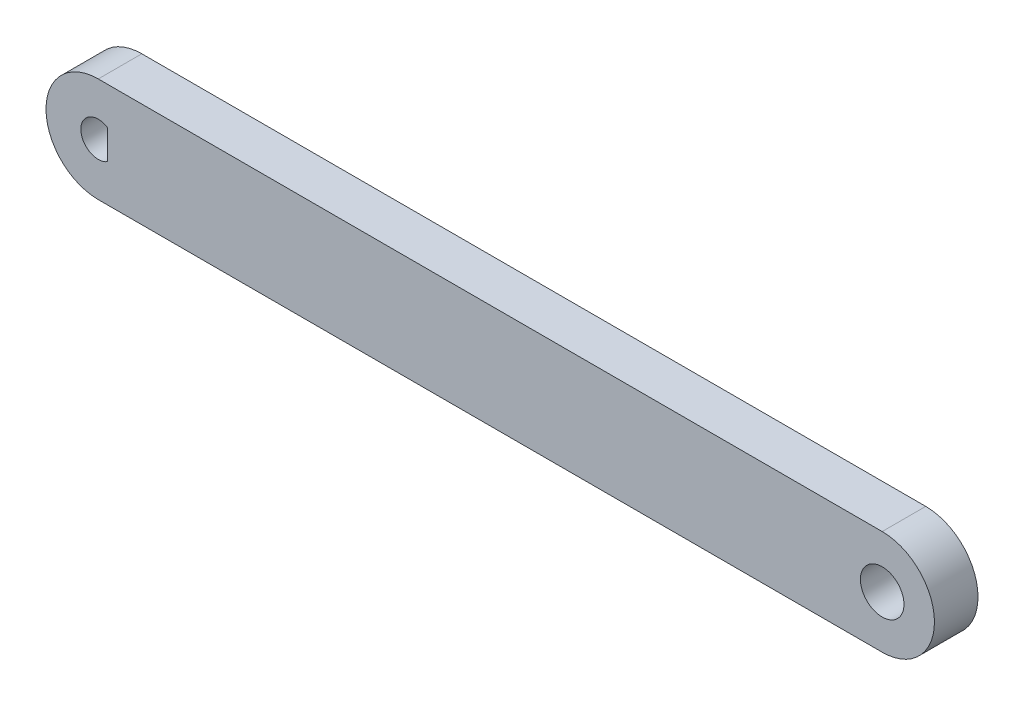
ISO-10303-21;
HEADER;
FILE_DESCRIPTION(('STEP AP214'),'2;1');
FILE_NAME('part.step','',(''),(''),'','','');
FILE_SCHEMA(('AUTOMOTIVE_DESIGN { 1 0 10303 214 1 1 1 1 }'));
ENDSEC;
DATA;
#1=APPLICATION_CONTEXT('core data for automotive mechanical design processes');
#2=APPLICATION_PROTOCOL_DEFINITION('international standard','automotive_design',2000,#1);
#3=PRODUCT_CONTEXT('',#1,'mechanical');
#4=PRODUCT('Part','Part','',(#3));
#5=PRODUCT_RELATED_PRODUCT_CATEGORY('part','',(#4));
#6=PRODUCT_DEFINITION_FORMATION('','',#4);
#7=PRODUCT_DEFINITION_CONTEXT('part definition',#1,'design');
#8=PRODUCT_DEFINITION('design','',#6,#7);
#9=PRODUCT_DEFINITION_SHAPE('','',#8);
#10=(LENGTH_UNIT() NAMED_UNIT(*) SI_UNIT(.MILLI.,.METRE.));
#11=(NAMED_UNIT(*) PLANE_ANGLE_UNIT() SI_UNIT($,.RADIAN.));
#12=(NAMED_UNIT(*) SI_UNIT($,.STERADIAN.) SOLID_ANGLE_UNIT());
#13=UNCERTAINTY_MEASURE_WITH_UNIT(LENGTH_MEASURE(1.E-05),#10,'distance_accuracy_value','');
#14=(GEOMETRIC_REPRESENTATION_CONTEXT(3) GLOBAL_UNCERTAINTY_ASSIGNED_CONTEXT((#13)) GLOBAL_UNIT_ASSIGNED_CONTEXT((#10,
#11,#12)) REPRESENTATION_CONTEXT('',''));
#15=CARTESIAN_POINT('',(0.,0.,0.));
#16=DIRECTION('',(0.,0.,1.));
#17=DIRECTION('',(1.,0.,0.));
#18=AXIS2_PLACEMENT_3D('',#15,#16,#17);
#19=CARTESIAN_POINT('',(-45.,0.,2.5));
#20=DIRECTION('',(0.,0.,1.));
#21=DIRECTION('',(1.,0.,0.));
#22=AXIS2_PLACEMENT_3D('',#19,#20,#21);
#23=PLANE('',#22);
#24=CARTESIAN_POINT('',(45.,0.,2.5));
#25=DIRECTION('',(0.,0.,1.));
#26=DIRECTION('',(1.,0.,0.));
#27=AXIS2_PLACEMENT_3D('',#24,#25,#26);
#28=CIRCLE('',#27,2.49999999999999);
#29=CARTESIAN_POINT('',(47.5,0.,2.5));
#30=VERTEX_POINT('',#29);
#31=EDGE_CURVE('E131',#30,#30,#28,.T.);
#32=ORIENTED_EDGE('',*,*,#31,.F.);
#33=EDGE_LOOP('',(#32));
#34=FACE_BOUND('',#33,.T.);
#35=CARTESIAN_POINT('',(-45.,0.,2.5));
#36=DIRECTION('',(0.,0.,1.));
#37=DIRECTION('',(1.,0.,0.));
#38=AXIS2_PLACEMENT_3D('',#35,#36,#37);
#39=CIRCLE('',#38,6.00000000000002);
#40=CARTESIAN_POINT('',(-45.,6.00000000000002,2.5));
#41=VERTEX_POINT('',#40);
#42=CARTESIAN_POINT('',(-45.,-6.00000000000002,2.5));
#43=VERTEX_POINT('',#42);
#44=EDGE_CURVE('E137',#41,#43,#39,.T.);
#45=ORIENTED_EDGE('',*,*,#44,.T.);
#46=DIRECTION('',(1.,0.,0.));
#47=VECTOR('',#46,1.);
#48=CARTESIAN_POINT('',(-45.,-6.00000000000002,2.5));
#49=LINE('',#48,#47);
#50=CARTESIAN_POINT('',(45.,-6.,2.5));
#51=VERTEX_POINT('',#50);
#52=EDGE_CURVE('E91',#43,#51,#49,.T.);
#53=ORIENTED_EDGE('',*,*,#52,.T.);
#54=CARTESIAN_POINT('',(45.,0.,2.5));
#55=DIRECTION('',(0.,0.,1.));
#56=DIRECTION('',(1.,0.,0.));
#57=AXIS2_PLACEMENT_3D('',#54,#55,#56);
#58=CIRCLE('',#57,6.00000000000002);
#59=CARTESIAN_POINT('',(45.,6.00000000000003,2.5));
#60=VERTEX_POINT('',#59);
#61=EDGE_CURVE('E140',#51,#60,#58,.T.);
#62=ORIENTED_EDGE('',*,*,#61,.T.);
#63=DIRECTION('',(-1.,0.,0.));
#64=VECTOR('',#63,1.);
#65=CARTESIAN_POINT('',(-45.,6.00000000000002,2.5));
#66=LINE('',#65,#64);
#67=EDGE_CURVE('E60',#60,#41,#66,.T.);
#68=ORIENTED_EDGE('',*,*,#67,.T.);
#69=EDGE_LOOP('',(#45,#53,#62,#68));
#70=FACE_BOUND('',#69,.T.);
#71=CARTESIAN_POINT('',(-45.,0.,2.5));
#72=DIRECTION('',(0.,0.,1.));
#73=DIRECTION('',(1.,0.,0.));
#74=AXIS2_PLACEMENT_3D('',#71,#72,#73);
#75=CIRCLE('',#74,2.);
#76=CARTESIAN_POINT('',(-43.934051012223,1.6922626142113,2.5));
#77=VERTEX_POINT('',#76);
#78=CARTESIAN_POINT('',(-43.934051012223,-1.6922626142113,2.5));
#79=VERTEX_POINT('',#78);
#80=EDGE_CURVE('E125',#77,#79,#75,.T.);
#81=ORIENTED_EDGE('',*,*,#80,.F.);
#82=DIRECTION('',(0.,1.,0.));
#83=VECTOR('',#82,1.);
#84=CARTESIAN_POINT('',(-43.934051012223,0.,2.5));
#85=LINE('',#84,#83);
#86=EDGE_CURVE('E117',#79,#77,#85,.T.);
#87=ORIENTED_EDGE('',*,*,#86,.F.);
#88=EDGE_LOOP('',(#81,#87));
#89=FACE_BOUND('',#88,.T.);
#90=ADVANCED_FACE('F43',(#34,#70,#89),#23,.T.);
#91=CARTESIAN_POINT('',(-45.,0.,-2.5));
#92=DIRECTION('',(0.,0.,1.));
#93=DIRECTION('',(1.,0.,0.));
#94=AXIS2_PLACEMENT_3D('',#91,#92,#93);
#95=PLANE('',#94);
#96=CARTESIAN_POINT('',(-45.,0.,-2.5));
#97=DIRECTION('',(0.,0.,1.));
#98=DIRECTION('',(1.,0.,0.));
#99=AXIS2_PLACEMENT_3D('',#96,#97,#98);
#100=CIRCLE('',#99,6.00000000000002);
#101=CARTESIAN_POINT('',(-45.,6.00000000000002,-2.5));
#102=VERTEX_POINT('',#101);
#103=CARTESIAN_POINT('',(-45.,-6.00000000000002,-2.5));
#104=VERTEX_POINT('',#103);
#105=EDGE_CURVE('E134',#102,#104,#100,.T.);
#106=ORIENTED_EDGE('',*,*,#105,.F.);
#107=DIRECTION('',(-1.,0.,0.));
#108=VECTOR('',#107,1.);
#109=CARTESIAN_POINT('',(-45.,6.00000000000002,-2.5));
#110=LINE('',#109,#108);
#111=CARTESIAN_POINT('',(45.,6.00000000000003,-2.5));
#112=VERTEX_POINT('',#111);
#113=EDGE_CURVE('E84',#112,#102,#110,.T.);
#114=ORIENTED_EDGE('',*,*,#113,.F.);
#115=CARTESIAN_POINT('',(45.,0.,-2.5));
#116=DIRECTION('',(0.,0.,1.));
#117=DIRECTION('',(1.,0.,0.));
#118=AXIS2_PLACEMENT_3D('',#115,#116,#117);
#119=CIRCLE('',#118,6.00000000000002);
#120=CARTESIAN_POINT('',(45.,-6.,-2.5));
#121=VERTEX_POINT('',#120);
#122=EDGE_CURVE('E78',#121,#112,#119,.T.);
#123=ORIENTED_EDGE('',*,*,#122,.F.);
#124=DIRECTION('',(1.,0.,0.));
#125=VECTOR('',#124,1.);
#126=CARTESIAN_POINT('',(-45.,-6.00000000000002,-2.5));
#127=LINE('',#126,#125);
#128=EDGE_CURVE('E146',#104,#121,#127,.T.);
#129=ORIENTED_EDGE('',*,*,#128,.F.);
#130=EDGE_LOOP('',(#106,#114,#123,#129));
#131=FACE_BOUND('',#130,.T.);
#132=CARTESIAN_POINT('',(45.,0.,-2.5));
#133=DIRECTION('',(0.,0.,1.));
#134=DIRECTION('',(1.,0.,0.));
#135=AXIS2_PLACEMENT_3D('',#132,#133,#134);
#136=CIRCLE('',#135,2.49999999999999);
#137=CARTESIAN_POINT('',(47.5,0.,-2.5));
#138=VERTEX_POINT('',#137);
#139=EDGE_CURVE('E129',#138,#138,#136,.T.);
#140=ORIENTED_EDGE('',*,*,#139,.T.);
#141=EDGE_LOOP('',(#140));
#142=FACE_BOUND('',#141,.T.);
#143=CARTESIAN_POINT('',(-45.,0.,-2.5));
#144=DIRECTION('',(0.,0.,1.));
#145=DIRECTION('',(1.,0.,0.));
#146=AXIS2_PLACEMENT_3D('',#143,#144,#145);
#147=CIRCLE('',#146,2.);
#148=CARTESIAN_POINT('',(-43.934051012223,1.6922626142113,-2.5));
#149=VERTEX_POINT('',#148);
#150=CARTESIAN_POINT('',(-43.934051012223,-1.6922626142113,-2.5));
#151=VERTEX_POINT('',#150);
#152=EDGE_CURVE('E109',#149,#151,#147,.T.);
#153=ORIENTED_EDGE('',*,*,#152,.T.);
#154=DIRECTION('',(0.,1.,0.));
#155=VECTOR('',#154,1.);
#156=CARTESIAN_POINT('',(-43.934051012223,0.,-2.5));
#157=LINE('',#156,#155);
#158=EDGE_CURVE('E105',#151,#149,#157,.T.);
#159=ORIENTED_EDGE('',*,*,#158,.T.);
#160=EDGE_LOOP('',(#153,#159));
#161=FACE_BOUND('',#160,.T.);
#162=ADVANCED_FACE('F107',(#131,#142,#161),#95,.F.);
#163=CARTESIAN_POINT('',(-45.,0.,2.5));
#164=DIRECTION('',(0.,0.,-1.));
#165=DIRECTION('',(-1.,0.,0.));
#166=AXIS2_PLACEMENT_3D('',#163,#164,#165);
#167=CYLINDRICAL_SURFACE('',#166,6.00000000000002);
#168=ORIENTED_EDGE('',*,*,#105,.T.);
#169=DIRECTION('',(0.,0.,-1.));
#170=VECTOR('',#169,1.);
#171=CARTESIAN_POINT('',(-45.,-6.00000000000002,2.5));
#172=LINE('',#171,#170);
#173=EDGE_CURVE('E11',#43,#104,#172,.T.);
#174=ORIENTED_EDGE('',*,*,#173,.F.);
#175=ORIENTED_EDGE('',*,*,#44,.F.);
#176=DIRECTION('',(0.,0.,-1.));
#177=VECTOR('',#176,1.);
#178=CARTESIAN_POINT('',(-45.,6.00000000000002,2.5));
#179=LINE('',#178,#177);
#180=EDGE_CURVE('E143',#41,#102,#179,.T.);
#181=ORIENTED_EDGE('',*,*,#180,.T.);
#182=EDGE_LOOP('',(#168,#174,#175,#181));
#183=FACE_BOUND('',#182,.T.);
#184=ADVANCED_FACE('F45',(#183),#167,.T.);
#185=CARTESIAN_POINT('',(-45.,-6.00000000000002,2.5));
#186=DIRECTION('',(0.,1.,0.));
#187=DIRECTION('',(-1.,0.,0.));
#188=AXIS2_PLACEMENT_3D('',#185,#186,#187);
#189=PLANE('',#188);
#190=ORIENTED_EDGE('',*,*,#128,.T.);
#191=DIRECTION('',(0.,0.,-1.));
#192=VECTOR('',#191,1.);
#193=CARTESIAN_POINT('',(45.,-6.,2.5));
#194=LINE('',#193,#192);
#195=EDGE_CURVE('E52',#51,#121,#194,.T.);
#196=ORIENTED_EDGE('',*,*,#195,.F.);
#197=ORIENTED_EDGE('',*,*,#52,.F.);
#198=ORIENTED_EDGE('',*,*,#173,.T.);
#199=EDGE_LOOP('',(#190,#196,#197,#198));
#200=FACE_BOUND('',#199,.T.);
#201=ADVANCED_FACE('F170',(#200),#189,.F.);
#202=CARTESIAN_POINT('',(45.,0.,2.5));
#203=DIRECTION('',(0.,0.,-1.));
#204=DIRECTION('',(-1.,0.,0.));
#205=AXIS2_PLACEMENT_3D('',#202,#203,#204);
#206=CYLINDRICAL_SURFACE('',#205,6.00000000000002);
#207=ORIENTED_EDGE('',*,*,#122,.T.);
#208=DIRECTION('',(0.,0.,-1.));
#209=VECTOR('',#208,1.);
#210=CARTESIAN_POINT('',(45.,6.00000000000003,2.5));
#211=LINE('',#210,#209);
#212=EDGE_CURVE('E151',#60,#112,#211,.T.);
#213=ORIENTED_EDGE('',*,*,#212,.F.);
#214=ORIENTED_EDGE('',*,*,#61,.F.);
#215=ORIENTED_EDGE('',*,*,#195,.T.);
#216=EDGE_LOOP('',(#207,#213,#214,#215));
#217=FACE_BOUND('',#216,.T.);
#218=ADVANCED_FACE('F153',(#217),#206,.T.);
#219=CARTESIAN_POINT('',(-45.,6.00000000000002,2.5));
#220=DIRECTION('',(0.,-1.,0.));
#221=DIRECTION('',(1.,0.,0.));
#222=AXIS2_PLACEMENT_3D('',#219,#220,#221);
#223=PLANE('',#222);
#224=ORIENTED_EDGE('',*,*,#113,.T.);
#225=ORIENTED_EDGE('',*,*,#180,.F.);
#226=ORIENTED_EDGE('',*,*,#67,.F.);
#227=ORIENTED_EDGE('',*,*,#212,.T.);
#228=EDGE_LOOP('',(#224,#225,#226,#227));
#229=FACE_BOUND('',#228,.T.);
#230=ADVANCED_FACE('F160',(#229),#223,.F.);
#231=CARTESIAN_POINT('',(45.,0.,2.5));
#232=DIRECTION('',(0.,0.,-1.));
#233=DIRECTION('',(-1.,0.,0.));
#234=AXIS2_PLACEMENT_3D('',#231,#232,#233);
#235=CYLINDRICAL_SURFACE('',#234,2.49999999999999);
#236=ORIENTED_EDGE('',*,*,#31,.T.);
#237=EDGE_LOOP('',(#236));
#238=FACE_BOUND('',#237,.T.);
#239=ORIENTED_EDGE('',*,*,#139,.F.);
#240=EDGE_LOOP('',(#239));
#241=FACE_BOUND('',#240,.T.);
#242=ADVANCED_FACE('F162',(#238,#241),#235,.F.);
#243=CARTESIAN_POINT('',(-45.,0.,-2.5));
#244=DIRECTION('',(0.,0.,1.));
#245=DIRECTION('',(1.,0.,0.));
#246=AXIS2_PLACEMENT_3D('',#243,#244,#245);
#247=CYLINDRICAL_SURFACE('',#246,2.);
#248=ORIENTED_EDGE('',*,*,#80,.T.);
#249=DIRECTION('',(0.,0.,1.));
#250=VECTOR('',#249,1.);
#251=CARTESIAN_POINT('',(-43.934051012223,-1.6922626142113,-2.5));
#252=LINE('',#251,#250);
#253=EDGE_CURVE('E121',#151,#79,#252,.T.);
#254=ORIENTED_EDGE('',*,*,#253,.F.);
#255=ORIENTED_EDGE('',*,*,#152,.F.);
#256=DIRECTION('',(0.,0.,1.));
#257=VECTOR('',#256,1.);
#258=CARTESIAN_POINT('',(-43.934051012223,1.6922626142113,-2.5));
#259=LINE('',#258,#257);
#260=EDGE_CURVE('E113',#149,#77,#259,.T.);
#261=ORIENTED_EDGE('',*,*,#260,.T.);
#262=EDGE_LOOP('',(#248,#254,#255,#261));
#263=FACE_BOUND('',#262,.T.);
#264=ADVANCED_FACE('F123',(#263),#247,.F.);
#265=CARTESIAN_POINT('',(-43.934051012223,0.,-2.5));
#266=DIRECTION('',(1.,0.,0.));
#267=DIRECTION('',(0.,0.,-1.));
#268=AXIS2_PLACEMENT_3D('',#265,#266,#267);
#269=PLANE('',#268);
#270=ORIENTED_EDGE('',*,*,#86,.T.);
#271=ORIENTED_EDGE('',*,*,#260,.F.);
#272=ORIENTED_EDGE('',*,*,#158,.F.);
#273=ORIENTED_EDGE('',*,*,#253,.T.);
#274=EDGE_LOOP('',(#270,#271,#272,#273));
#275=FACE_BOUND('',#274,.T.);
#276=ADVANCED_FACE('F116',(#275),#269,.F.);
#277=CLOSED_SHELL('',(#90,#162,#184,#201,#218,#230,#242,#264,#276));
#278=MANIFOLD_SOLID_BREP('B2',#277);
#279=ADVANCED_BREP_SHAPE_REPRESENTATION('',(#18,#278),#14);
#280=SHAPE_DEFINITION_REPRESENTATION(#9,#279);
ENDSEC;
END-ISO-10303-21;
